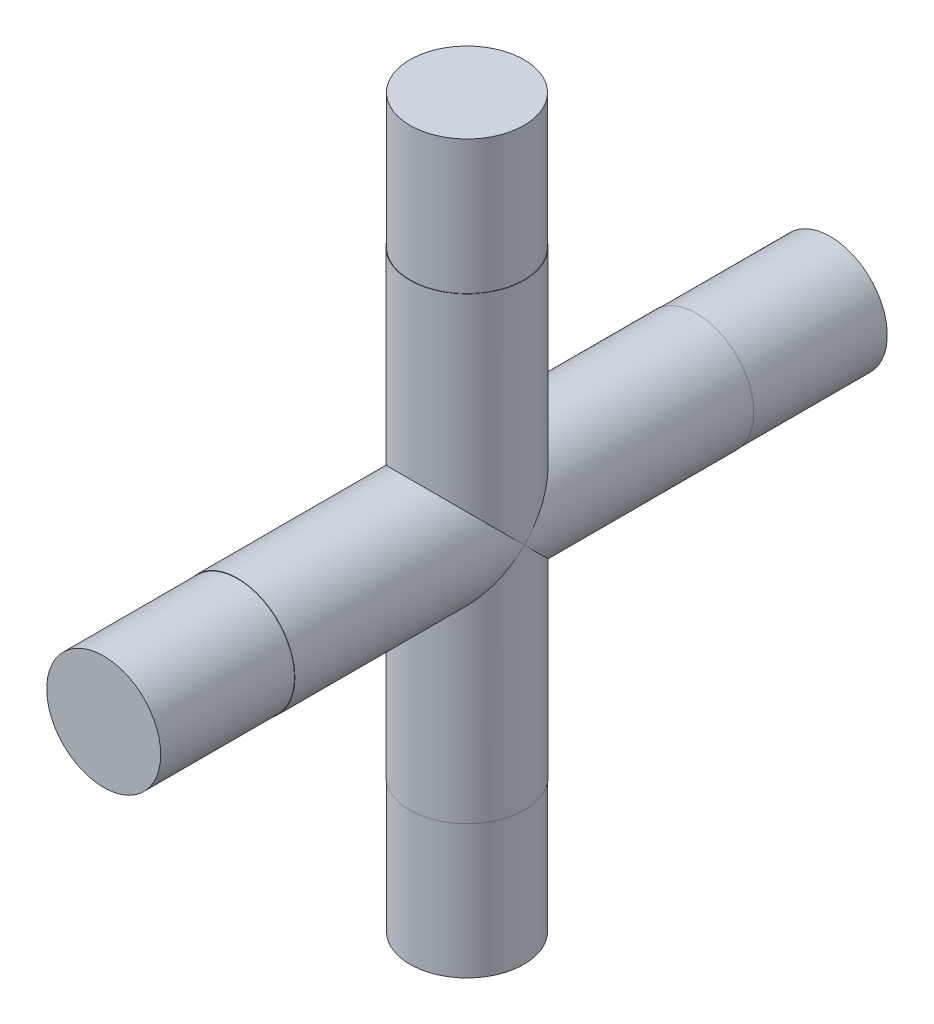
ISO-10303-21;
HEADER;
FILE_DESCRIPTION(('STEP AP214'),'2;1');
FILE_NAME('part.step','',(''),(''),'','','');
FILE_SCHEMA(('AUTOMOTIVE_DESIGN { 1 0 10303 214 1 1 1 1 }'));
ENDSEC;
DATA;
#1=APPLICATION_CONTEXT('core data for automotive mechanical design processes');
#2=APPLICATION_PROTOCOL_DEFINITION('international standard','automotive_design',2000,#1);
#3=PRODUCT_CONTEXT('',#1,'mechanical');
#4=PRODUCT('Part','Part','',(#3));
#5=PRODUCT_RELATED_PRODUCT_CATEGORY('part','',(#4));
#6=PRODUCT_DEFINITION_FORMATION('','',#4);
#7=PRODUCT_DEFINITION_CONTEXT('part definition',#1,'design');
#8=PRODUCT_DEFINITION('design','',#6,#7);
#9=PRODUCT_DEFINITION_SHAPE('','',#8);
#10=(LENGTH_UNIT() NAMED_UNIT(*) SI_UNIT(.MILLI.,.METRE.));
#11=(NAMED_UNIT(*) PLANE_ANGLE_UNIT() SI_UNIT($,.RADIAN.));
#12=(NAMED_UNIT(*) SI_UNIT($,.STERADIAN.) SOLID_ANGLE_UNIT());
#13=UNCERTAINTY_MEASURE_WITH_UNIT(LENGTH_MEASURE(1.E-05),#10,'distance_accuracy_value','');
#14=(GEOMETRIC_REPRESENTATION_CONTEXT(3) GLOBAL_UNCERTAINTY_ASSIGNED_CONTEXT((#13)) GLOBAL_UNIT_ASSIGNED_CONTEXT((#10,
#11,#12)) REPRESENTATION_CONTEXT('',''));
#15=CARTESIAN_POINT('',(0.,0.,0.));
#16=DIRECTION('',(0.,0.,1.));
#17=DIRECTION('',(1.,0.,0.));
#18=AXIS2_PLACEMENT_3D('',#15,#16,#17);
#19=CARTESIAN_POINT('',(0.,19.,0.));
#20=DIRECTION('',(0.,-1.,0.));
#21=DIRECTION('',(0.,0.,-1.));
#22=AXIS2_PLACEMENT_3D('',#19,#20,#21);
#23=CYLINDRICAL_SURFACE('',#22,1.5);
#24=CARTESIAN_POINT('',(0.,9.5,0.));
#25=DIRECTION('',(0.,-0.707106781186547,-0.707106781186547));
#26=DIRECTION('',(0.,-0.707106781186547,0.707106781186547));
#27=AXIS2_PLACEMENT_3D('',#24,#25,#26);
#28=ELLIPSE('',#27,2.12132034355965,1.5);
#29=CARTESIAN_POINT('',(1.5,9.5,0.));
#30=VERTEX_POINT('',#29);
#31=CARTESIAN_POINT('',(-1.5,9.5,0.));
#32=VERTEX_POINT('',#31);
#33=EDGE_CURVE('E51',#30,#32,#28,.T.);
#34=ORIENTED_EDGE('',*,*,#33,.T.);
#35=CARTESIAN_POINT('',(0.,9.5,0.));
#36=DIRECTION('',(0.,-0.707106781186547,0.707106781186547));
#37=DIRECTION('',(0.,-0.707106781186547,-0.707106781186547));
#38=AXIS2_PLACEMENT_3D('',#35,#36,#37);
#39=ELLIPSE('',#38,2.12132034355965,1.5);
#40=EDGE_CURVE('E40',#32,#30,#39,.T.);
#41=ORIENTED_EDGE('',*,*,#40,.T.);
#42=EDGE_LOOP('',(#34,#41));
#43=FACE_BOUND('',#42,.T.);
#44=CARTESIAN_POINT('',(0.,3.5,0.));
#45=DIRECTION('',(0.,-1.,0.));
#46=DIRECTION('',(0.,0.,-1.));
#47=AXIS2_PLACEMENT_3D('',#44,#45,#46);
#48=CIRCLE('',#47,1.5);
#49=CARTESIAN_POINT('',(0.,3.5,-1.5));
#50=VERTEX_POINT('',#49);
#51=EDGE_CURVE('E90',#50,#50,#48,.T.);
#52=ORIENTED_EDGE('',*,*,#51,.F.);
#53=EDGE_LOOP('',(#52));
#54=FACE_BOUND('',#53,.T.);
#55=ADVANCED_FACE('F33',(#43,#54),#23,.T.);
#56=CARTESIAN_POINT('',(0.,9.5,0.));
#57=DIRECTION('',(0.,-0.707106781186547,-0.707106781186547));
#58=DIRECTION('',(0.,-0.707106781186547,0.707106781186547));
#59=AXIS2_PLACEMENT_3D('',#56,#57,#58);
#60=ELLIPSE('',#59,2.12132034355965,1.5);
#61=EDGE_CURVE('E45',#30,#32,#60,.F.);
#62=ORIENTED_EDGE('',*,*,#61,.T.);
#63=CARTESIAN_POINT('',(0.,9.5,0.));
#64=DIRECTION('',(0.,-0.707106781186547,0.707106781186547));
#65=DIRECTION('',(0.,-0.707106781186547,-0.707106781186547));
#66=AXIS2_PLACEMENT_3D('',#63,#64,#65);
#67=ELLIPSE('',#66,2.12132034355965,1.5);
#68=EDGE_CURVE('E11',#32,#30,#67,.F.);
#69=ORIENTED_EDGE('',*,*,#68,.T.);
#70=EDGE_LOOP('',(#62,#69));
#71=FACE_BOUND('',#70,.T.);
#72=CARTESIAN_POINT('',(0.,15.5,0.));
#73=DIRECTION('',(0.,1.,0.));
#74=DIRECTION('',(0.,0.,1.));
#75=AXIS2_PLACEMENT_3D('',#72,#73,#74);
#76=CIRCLE('',#75,1.5);
#77=CARTESIAN_POINT('',(0.,15.5,1.5));
#78=VERTEX_POINT('',#77);
#79=EDGE_CURVE('E81',#78,#78,#76,.T.);
#80=ORIENTED_EDGE('',*,*,#79,.F.);
#81=EDGE_LOOP('',(#80));
#82=FACE_BOUND('',#81,.T.);
#83=ADVANCED_FACE('F62',(#71,#82),#23,.T.);
#84=CARTESIAN_POINT('',(0.,9.5,-9.5));
#85=DIRECTION('',(0.,0.,1.));
#86=DIRECTION('',(1.,0.,0.));
#87=AXIS2_PLACEMENT_3D('',#84,#85,#86);
#88=CYLINDRICAL_SURFACE('',#87,1.5);
#89=ORIENTED_EDGE('',*,*,#68,.F.);
#90=ORIENTED_EDGE('',*,*,#33,.F.);
#91=EDGE_LOOP('',(#89,#90));
#92=FACE_BOUND('',#91,.T.);
#93=CARTESIAN_POINT('',(0.,9.5,6.));
#94=DIRECTION('',(0.,0.,1.));
#95=DIRECTION('',(1.,0.,0.));
#96=AXIS2_PLACEMENT_3D('',#93,#94,#95);
#97=CIRCLE('',#96,1.5);
#98=CARTESIAN_POINT('',(1.5,9.5,6.));
#99=VERTEX_POINT('',#98);
#100=EDGE_CURVE('E72',#99,#99,#97,.T.);
#101=ORIENTED_EDGE('',*,*,#100,.F.);
#102=EDGE_LOOP('',(#101));
#103=FACE_BOUND('',#102,.T.);
#104=ADVANCED_FACE('F52',(#92,#103),#88,.T.);
#105=ORIENTED_EDGE('',*,*,#40,.F.);
#106=ORIENTED_EDGE('',*,*,#61,.F.);
#107=EDGE_LOOP('',(#105,#106));
#108=FACE_BOUND('',#107,.T.);
#109=CARTESIAN_POINT('',(0.,9.5,-6.));
#110=DIRECTION('',(0.,0.,-1.));
#111=DIRECTION('',(-1.,0.,0.));
#112=AXIS2_PLACEMENT_3D('',#109,#110,#111);
#113=CIRCLE('',#112,1.5);
#114=CARTESIAN_POINT('',(-1.5,9.5,-6.));
#115=VERTEX_POINT('',#114);
#116=EDGE_CURVE('E60',#115,#115,#113,.T.);
#117=ORIENTED_EDGE('',*,*,#116,.F.);
#118=EDGE_LOOP('',(#117));
#119=FACE_BOUND('',#118,.T.);
#120=ADVANCED_FACE('F58',(#108,#119),#88,.T.);
#121=CARTESIAN_POINT('',(0.,9.5,-6.));
#122=DIRECTION('',(0.,0.,-1.));
#123=DIRECTION('',(-1.,0.,0.));
#124=AXIS2_PLACEMENT_3D('',#121,#122,#123);
#125=PLANE('',#124);
#126=CARTESIAN_POINT('',(0.,9.5,-6.));
#127=DIRECTION('',(0.,0.,-1.));
#128=DIRECTION('',(-1.,0.,0.));
#129=AXIS2_PLACEMENT_3D('',#126,#127,#128);
#130=CIRCLE('',#129,1.49);
#131=CARTESIAN_POINT('',(-1.49,9.5,-6.));
#132=VERTEX_POINT('',#131);
#133=EDGE_CURVE('E68',#132,#132,#130,.T.);
#134=ORIENTED_EDGE('',*,*,#133,.F.);
#135=EDGE_LOOP('',(#134));
#136=FACE_BOUND('',#135,.T.);
#137=ORIENTED_EDGE('',*,*,#116,.T.);
#138=EDGE_LOOP('',(#137));
#139=FACE_BOUND('',#138,.T.);
#140=ADVANCED_FACE('F122',(#136,#139),#125,.T.);
#141=CARTESIAN_POINT('',(0.,9.5,-6.));
#142=DIRECTION('',(0.,0.,-1.));
#143=DIRECTION('',(-1.,0.,0.));
#144=AXIS2_PLACEMENT_3D('',#141,#142,#143);
#145=CYLINDRICAL_SURFACE('',#144,1.49);
#146=ORIENTED_EDGE('',*,*,#133,.T.);
#147=EDGE_LOOP('',(#146));
#148=FACE_BOUND('',#147,.T.);
#149=CARTESIAN_POINT('',(0.,9.5,-9.5));
#150=DIRECTION('',(0.,0.,-1.));
#151=DIRECTION('',(-1.,0.,0.));
#152=AXIS2_PLACEMENT_3D('',#149,#150,#151);
#153=CIRCLE('',#152,1.49);
#154=CARTESIAN_POINT('',(-1.49,9.5,-9.5));
#155=VERTEX_POINT('',#154);
#156=EDGE_CURVE('E69',#155,#155,#153,.T.);
#157=ORIENTED_EDGE('',*,*,#156,.F.);
#158=EDGE_LOOP('',(#157));
#159=FACE_BOUND('',#158,.T.);
#160=ADVANCED_FACE('F157',(#148,#159),#145,.T.);
#161=CARTESIAN_POINT('',(0.,9.5,-9.5));
#162=DIRECTION('',(0.,0.,1.));
#163=DIRECTION('',(1.,0.,0.));
#164=AXIS2_PLACEMENT_3D('',#161,#162,#163);
#165=PLANE('',#164);
#166=ORIENTED_EDGE('',*,*,#156,.T.);
#167=EDGE_LOOP('',(#166));
#168=FACE_BOUND('',#167,.T.);
#169=ADVANCED_FACE('F125',(#168),#165,.F.);
#170=CARTESIAN_POINT('',(0.,9.5,6.));
#171=DIRECTION('',(0.,0.,1.));
#172=DIRECTION('',(1.,0.,0.));
#173=AXIS2_PLACEMENT_3D('',#170,#171,#172);
#174=PLANE('',#173);
#175=CARTESIAN_POINT('',(0.,9.5,6.));
#176=DIRECTION('',(0.,0.,1.));
#177=DIRECTION('',(1.,0.,0.));
#178=AXIS2_PLACEMENT_3D('',#175,#176,#177);
#179=CIRCLE('',#178,1.49);
#180=CARTESIAN_POINT('',(1.49,9.5,6.));
#181=VERTEX_POINT('',#180);
#182=EDGE_CURVE('E77',#181,#181,#179,.T.);
#183=ORIENTED_EDGE('',*,*,#182,.F.);
#184=EDGE_LOOP('',(#183));
#185=FACE_BOUND('',#184,.T.);
#186=ORIENTED_EDGE('',*,*,#100,.T.);
#187=EDGE_LOOP('',(#186));
#188=FACE_BOUND('',#187,.T.);
#189=ADVANCED_FACE('F152',(#185,#188),#174,.T.);
#190=CARTESIAN_POINT('',(0.,9.5,6.));
#191=DIRECTION('',(0.,0.,1.));
#192=DIRECTION('',(1.,0.,0.));
#193=AXIS2_PLACEMENT_3D('',#190,#191,#192);
#194=CYLINDRICAL_SURFACE('',#193,1.49);
#195=ORIENTED_EDGE('',*,*,#182,.T.);
#196=EDGE_LOOP('',(#195));
#197=FACE_BOUND('',#196,.T.);
#198=CARTESIAN_POINT('',(0.,9.5,9.5));
#199=DIRECTION('',(0.,0.,1.));
#200=DIRECTION('',(1.,0.,0.));
#201=AXIS2_PLACEMENT_3D('',#198,#199,#200);
#202=CIRCLE('',#201,1.49);
#203=CARTESIAN_POINT('',(1.49,9.5,9.5));
#204=VERTEX_POINT('',#203);
#205=EDGE_CURVE('E78',#204,#204,#202,.T.);
#206=ORIENTED_EDGE('',*,*,#205,.F.);
#207=EDGE_LOOP('',(#206));
#208=FACE_BOUND('',#207,.T.);
#209=ADVANCED_FACE('F149',(#197,#208),#194,.T.);
#210=CARTESIAN_POINT('',(0.,9.5,9.5));
#211=DIRECTION('',(0.,0.,1.));
#212=DIRECTION('',(1.,0.,0.));
#213=AXIS2_PLACEMENT_3D('',#210,#211,#212);
#214=PLANE('',#213);
#215=ORIENTED_EDGE('',*,*,#205,.T.);
#216=EDGE_LOOP('',(#215));
#217=FACE_BOUND('',#216,.T.);
#218=ADVANCED_FACE('F147',(#217),#214,.T.);
#219=CARTESIAN_POINT('',(0.,15.5,0.));
#220=DIRECTION('',(0.,1.,0.));
#221=DIRECTION('',(0.,0.,1.));
#222=AXIS2_PLACEMENT_3D('',#219,#220,#221);
#223=PLANE('',#222);
#224=CARTESIAN_POINT('',(0.,15.5,0.));
#225=DIRECTION('',(0.,1.,0.));
#226=DIRECTION('',(0.,0.,1.));
#227=AXIS2_PLACEMENT_3D('',#224,#225,#226);
#228=CIRCLE('',#227,1.49);
#229=CARTESIAN_POINT('',(0.,15.5,1.49));
#230=VERTEX_POINT('',#229);
#231=EDGE_CURVE('E86',#230,#230,#228,.T.);
#232=ORIENTED_EDGE('',*,*,#231,.F.);
#233=EDGE_LOOP('',(#232));
#234=FACE_BOUND('',#233,.T.);
#235=ORIENTED_EDGE('',*,*,#79,.T.);
#236=EDGE_LOOP('',(#235));
#237=FACE_BOUND('',#236,.T.);
#238=ADVANCED_FACE('F143',(#234,#237),#223,.T.);
#239=CARTESIAN_POINT('',(0.,15.5,0.));
#240=DIRECTION('',(0.,1.,0.));
#241=DIRECTION('',(0.,0.,1.));
#242=AXIS2_PLACEMENT_3D('',#239,#240,#241);
#243=CYLINDRICAL_SURFACE('',#242,1.49);
#244=ORIENTED_EDGE('',*,*,#231,.T.);
#245=EDGE_LOOP('',(#244));
#246=FACE_BOUND('',#245,.T.);
#247=CARTESIAN_POINT('',(0.,19.,0.));
#248=DIRECTION('',(0.,1.,0.));
#249=DIRECTION('',(0.,0.,1.));
#250=AXIS2_PLACEMENT_3D('',#247,#248,#249);
#251=CIRCLE('',#250,1.49);
#252=CARTESIAN_POINT('',(0.,19.,1.49));
#253=VERTEX_POINT('',#252);
#254=EDGE_CURVE('E87',#253,#253,#251,.T.);
#255=ORIENTED_EDGE('',*,*,#254,.F.);
#256=EDGE_LOOP('',(#255));
#257=FACE_BOUND('',#256,.T.);
#258=ADVANCED_FACE('F128',(#246,#257),#243,.T.);
#259=CARTESIAN_POINT('',(0.,19.,0.));
#260=DIRECTION('',(0.,1.,0.));
#261=DIRECTION('',(0.,0.,1.));
#262=AXIS2_PLACEMENT_3D('',#259,#260,#261);
#263=PLANE('',#262);
#264=ORIENTED_EDGE('',*,*,#254,.T.);
#265=EDGE_LOOP('',(#264));
#266=FACE_BOUND('',#265,.T.);
#267=ADVANCED_FACE('F108',(#266),#263,.T.);
#268=CARTESIAN_POINT('',(0.,3.5,0.));
#269=DIRECTION('',(0.,-1.,0.));
#270=DIRECTION('',(0.,0.,-1.));
#271=AXIS2_PLACEMENT_3D('',#268,#269,#270);
#272=PLANE('',#271);
#273=CARTESIAN_POINT('',(0.,3.5,0.));
#274=DIRECTION('',(0.,-1.,0.));
#275=DIRECTION('',(0.,0.,-1.));
#276=AXIS2_PLACEMENT_3D('',#273,#274,#275);
#277=CIRCLE('',#276,1.49);
#278=CARTESIAN_POINT('',(0.,3.5,-1.49));
#279=VERTEX_POINT('',#278);
#280=EDGE_CURVE('E95',#279,#279,#277,.T.);
#281=ORIENTED_EDGE('',*,*,#280,.F.);
#282=EDGE_LOOP('',(#281));
#283=FACE_BOUND('',#282,.T.);
#284=ORIENTED_EDGE('',*,*,#51,.T.);
#285=EDGE_LOOP('',(#284));
#286=FACE_BOUND('',#285,.T.);
#287=ADVANCED_FACE('F105',(#283,#286),#272,.T.);
#288=CARTESIAN_POINT('',(0.,3.5,0.));
#289=DIRECTION('',(0.,-1.,0.));
#290=DIRECTION('',(0.,0.,-1.));
#291=AXIS2_PLACEMENT_3D('',#288,#289,#290);
#292=CYLINDRICAL_SURFACE('',#291,1.49);
#293=ORIENTED_EDGE('',*,*,#280,.T.);
#294=EDGE_LOOP('',(#293));
#295=FACE_BOUND('',#294,.T.);
#296=CARTESIAN_POINT('',(0.,0.,0.));
#297=DIRECTION('',(0.,-1.,0.));
#298=DIRECTION('',(0.,0.,-1.));
#299=AXIS2_PLACEMENT_3D('',#296,#297,#298);
#300=CIRCLE('',#299,1.49);
#301=CARTESIAN_POINT('',(0.,0.,-1.49));
#302=VERTEX_POINT('',#301);
#303=EDGE_CURVE('E96',#302,#302,#300,.T.);
#304=ORIENTED_EDGE('',*,*,#303,.F.);
#305=EDGE_LOOP('',(#304));
#306=FACE_BOUND('',#305,.T.);
#307=ADVANCED_FACE('F102',(#295,#306),#292,.T.);
#308=CARTESIAN_POINT('',(0.,0.,0.));
#309=DIRECTION('',(0.,1.,0.));
#310=DIRECTION('',(0.,0.,1.));
#311=AXIS2_PLACEMENT_3D('',#308,#309,#310);
#312=PLANE('',#311);
#313=ORIENTED_EDGE('',*,*,#303,.T.);
#314=EDGE_LOOP('',(#313));
#315=FACE_BOUND('',#314,.T.);
#316=ADVANCED_FACE('F130',(#315),#312,.F.);
#317=CLOSED_SHELL('',(#55,#83,#104,#120,#140,#160,#169,#189,#209,#218,#238,#258,#267,#287,#307,#316));
#318=MANIFOLD_SOLID_BREP('B2',#317);
#319=ADVANCED_BREP_SHAPE_REPRESENTATION('',(#18,#318),#14);
#320=SHAPE_DEFINITION_REPRESENTATION(#9,#319);
ENDSEC;
END-ISO-10303-21;
